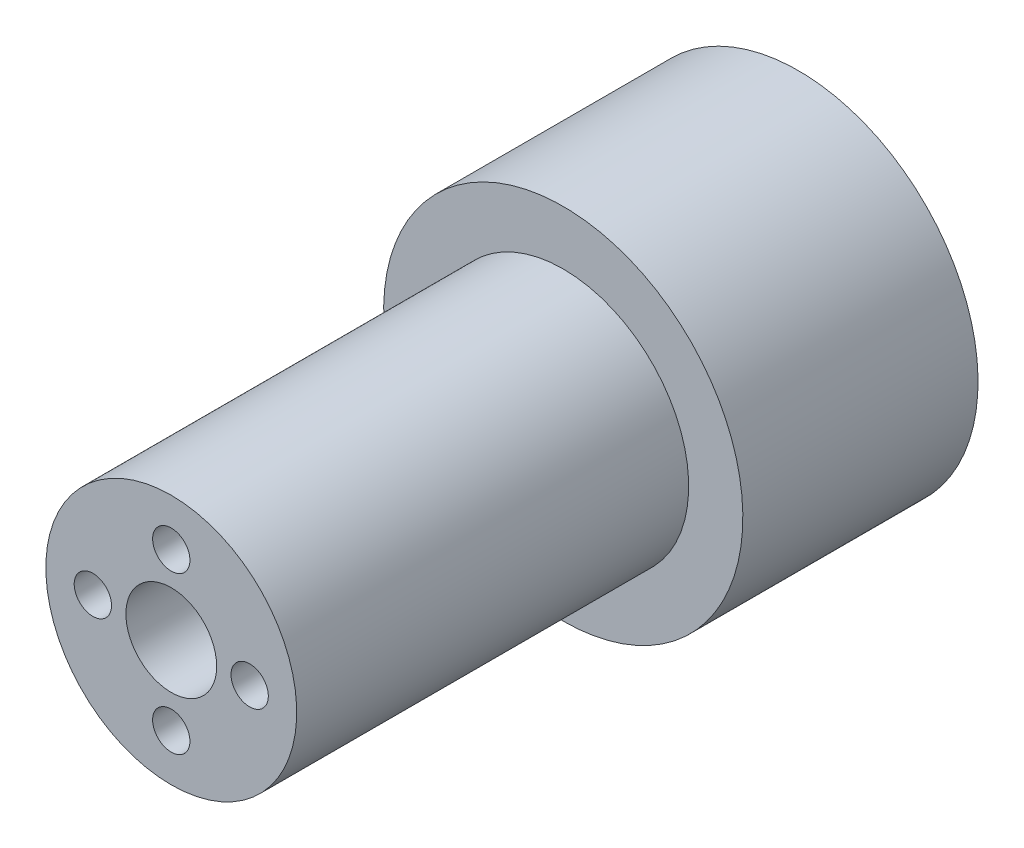
ISO-10303-21;
HEADER;
FILE_DESCRIPTION(('STEP AP214'),'2;1');
FILE_NAME('part.step','',(''),(''),'','','');
FILE_SCHEMA(('AUTOMOTIVE_DESIGN { 1 0 10303 214 1 1 1 1 }'));
ENDSEC;
DATA;
#1=APPLICATION_CONTEXT('core data for automotive mechanical design processes');
#2=APPLICATION_PROTOCOL_DEFINITION('international standard','automotive_design',2000,#1);
#3=PRODUCT_CONTEXT('',#1,'mechanical');
#4=PRODUCT('Part','Part','',(#3));
#5=PRODUCT_RELATED_PRODUCT_CATEGORY('part','',(#4));
#6=PRODUCT_DEFINITION_FORMATION('','',#4);
#7=PRODUCT_DEFINITION_CONTEXT('part definition',#1,'design');
#8=PRODUCT_DEFINITION('design','',#6,#7);
#9=PRODUCT_DEFINITION_SHAPE('','',#8);
#10=(LENGTH_UNIT() NAMED_UNIT(*) SI_UNIT(.MILLI.,.METRE.));
#11=(NAMED_UNIT(*) PLANE_ANGLE_UNIT() SI_UNIT($,.RADIAN.));
#12=(NAMED_UNIT(*) SI_UNIT($,.STERADIAN.) SOLID_ANGLE_UNIT());
#13=UNCERTAINTY_MEASURE_WITH_UNIT(LENGTH_MEASURE(1.E-05),#10,'distance_accuracy_value','');
#14=(GEOMETRIC_REPRESENTATION_CONTEXT(3) GLOBAL_UNCERTAINTY_ASSIGNED_CONTEXT((#13)) GLOBAL_UNIT_ASSIGNED_CONTEXT((#10,
#11,#12)) REPRESENTATION_CONTEXT('',''));
#15=CARTESIAN_POINT('',(0.,0.,0.));
#16=DIRECTION('',(0.,0.,1.));
#17=DIRECTION('',(1.,0.,0.));
#18=AXIS2_PLACEMENT_3D('',#15,#16,#17);
#19=CARTESIAN_POINT('',(0.,8.,0.));
#20=DIRECTION('',(0.,0.,-1.));
#21=DIRECTION('',(0.,1.,0.));
#22=AXIS2_PLACEMENT_3D('',#19,#20,#21);
#23=PLANE('',#22);
#24=CARTESIAN_POINT('',(0.,0.,0.));
#25=DIRECTION('',(0.,0.,1.));
#26=DIRECTION('',(1.,0.,0.));
#27=AXIS2_PLACEMENT_3D('',#24,#25,#26);
#28=CIRCLE('',#27,2.8956);
#29=CARTESIAN_POINT('',(2.8956,0.,0.));
#30=VERTEX_POINT('',#29);
#31=EDGE_CURVE('E82',#30,#30,#28,.T.);
#32=ORIENTED_EDGE('',*,*,#31,.F.);
#33=EDGE_LOOP('',(#32));
#34=FACE_BOUND('',#33,.T.);
#35=CARTESIAN_POINT('',(-5.,0.,0.));
#36=DIRECTION('',(0.,0.,1.));
#37=DIRECTION('',(1.,0.,0.));
#38=AXIS2_PLACEMENT_3D('',#35,#36,#37);
#39=CIRCLE('',#38,1.190625);
#40=CARTESIAN_POINT('',(-3.809375,0.,0.));
#41=VERTEX_POINT('',#40);
#42=EDGE_CURVE('E77',#41,#41,#39,.T.);
#43=ORIENTED_EDGE('',*,*,#42,.F.);
#44=EDGE_LOOP('',(#43));
#45=FACE_BOUND('',#44,.T.);
#46=CARTESIAN_POINT('',(0.,-5.,0.));
#47=DIRECTION('',(0.,0.,1.));
#48=DIRECTION('',(1.,0.,0.));
#49=AXIS2_PLACEMENT_3D('',#46,#47,#48);
#50=CIRCLE('',#49,1.190625);
#51=CARTESIAN_POINT('',(1.190625,-5.,0.));
#52=VERTEX_POINT('',#51);
#53=EDGE_CURVE('E68',#52,#52,#50,.T.);
#54=ORIENTED_EDGE('',*,*,#53,.F.);
#55=EDGE_LOOP('',(#54));
#56=FACE_BOUND('',#55,.T.);
#57=CARTESIAN_POINT('',(0.,5.,0.));
#58=DIRECTION('',(0.,0.,1.));
#59=DIRECTION('',(1.,0.,0.));
#60=AXIS2_PLACEMENT_3D('',#57,#58,#59);
#61=CIRCLE('',#60,1.190625);
#62=CARTESIAN_POINT('',(1.190625,5.,0.));
#63=VERTEX_POINT('',#62);
#64=EDGE_CURVE('E61',#63,#63,#61,.T.);
#65=ORIENTED_EDGE('',*,*,#64,.F.);
#66=EDGE_LOOP('',(#65));
#67=FACE_BOUND('',#66,.T.);
#68=CARTESIAN_POINT('',(5.,0.,0.));
#69=DIRECTION('',(0.,0.,1.));
#70=DIRECTION('',(1.,0.,0.));
#71=AXIS2_PLACEMENT_3D('',#68,#69,#70);
#72=CIRCLE('',#71,1.190625);
#73=CARTESIAN_POINT('',(6.190625,0.,0.));
#74=VERTEX_POINT('',#73);
#75=EDGE_CURVE('E60',#74,#74,#72,.T.);
#76=ORIENTED_EDGE('',*,*,#75,.F.);
#77=EDGE_LOOP('',(#76));
#78=FACE_BOUND('',#77,.T.);
#79=CARTESIAN_POINT('',(0.,0.,0.));
#80=DIRECTION('',(0.,0.,1.));
#81=DIRECTION('',(0.,-1.,0.));
#82=AXIS2_PLACEMENT_3D('',#79,#80,#81);
#83=CIRCLE('',#82,8.);
#84=CARTESIAN_POINT('',(0.,-8.,0.));
#85=VERTEX_POINT('',#84);
#86=EDGE_CURVE('E51',#85,#85,#83,.T.);
#87=ORIENTED_EDGE('',*,*,#86,.T.);
#88=EDGE_LOOP('',(#87));
#89=FACE_BOUND('',#88,.T.);
#90=ADVANCED_FACE('F40',(#34,#45,#56,#67,#78,#89),#23,.F.);
#91=CARTESIAN_POINT('',(0.,0.,-40.));
#92=DIRECTION('',(0.,0.,1.));
#93=DIRECTION('',(0.,-1.,0.));
#94=AXIS2_PLACEMENT_3D('',#91,#92,#93);
#95=PLANE('',#94);
#96=CARTESIAN_POINT('',(0.,0.,-40.));
#97=DIRECTION('',(0.,0.,1.));
#98=DIRECTION('',(0.,-1.,0.));
#99=AXIS2_PLACEMENT_3D('',#96,#97,#98);
#100=CIRCLE('',#99,11.455);
#101=CARTESIAN_POINT('',(0.,-11.455,-40.));
#102=VERTEX_POINT('',#101);
#103=EDGE_CURVE('E10',#102,#102,#100,.T.);
#104=ORIENTED_EDGE('',*,*,#103,.F.);
#105=EDGE_LOOP('',(#104));
#106=FACE_BOUND('',#105,.T.);
#107=ADVANCED_FACE('F96',(#106),#95,.F.);
#108=CARTESIAN_POINT('',(0.,0.,0.));
#109=DIRECTION('',(0.,0.,1.));
#110=DIRECTION('',(0.,-1.,0.));
#111=AXIS2_PLACEMENT_3D('',#108,#109,#110);
#112=CYLINDRICAL_SURFACE('',#111,11.455);
#113=CARTESIAN_POINT('',(0.,0.,-25.));
#114=DIRECTION('',(0.,0.,1.));
#115=DIRECTION('',(0.,-1.,0.));
#116=AXIS2_PLACEMENT_3D('',#113,#114,#115);
#117=CIRCLE('',#116,11.455);
#118=CARTESIAN_POINT('',(0.,-11.455,-25.));
#119=VERTEX_POINT('',#118);
#120=EDGE_CURVE('E43',#119,#119,#117,.T.);
#121=ORIENTED_EDGE('',*,*,#120,.F.);
#122=EDGE_LOOP('',(#121));
#123=FACE_BOUND('',#122,.T.);
#124=ORIENTED_EDGE('',*,*,#103,.T.);
#125=EDGE_LOOP('',(#124));
#126=FACE_BOUND('',#125,.T.);
#127=ADVANCED_FACE('F117',(#123,#126),#112,.T.);
#128=CARTESIAN_POINT('',(0.,11.455,-25.));
#129=DIRECTION('',(0.,0.,-1.));
#130=DIRECTION('',(0.,1.,0.));
#131=AXIS2_PLACEMENT_3D('',#128,#129,#130);
#132=PLANE('',#131);
#133=CARTESIAN_POINT('',(0.,0.,-25.));
#134=DIRECTION('',(0.,0.,1.));
#135=DIRECTION('',(0.,-1.,0.));
#136=AXIS2_PLACEMENT_3D('',#133,#134,#135);
#137=CIRCLE('',#136,8.);
#138=CARTESIAN_POINT('',(0.,-8.,-25.));
#139=VERTEX_POINT('',#138);
#140=EDGE_CURVE('E50',#139,#139,#137,.T.);
#141=ORIENTED_EDGE('',*,*,#140,.F.);
#142=EDGE_LOOP('',(#141));
#143=FACE_BOUND('',#142,.T.);
#144=ORIENTED_EDGE('',*,*,#120,.T.);
#145=EDGE_LOOP('',(#144));
#146=FACE_BOUND('',#145,.T.);
#147=ADVANCED_FACE('F113',(#143,#146),#132,.F.);
#148=CARTESIAN_POINT('',(0.,0.,0.));
#149=DIRECTION('',(0.,0.,1.));
#150=DIRECTION('',(0.,-1.,0.));
#151=AXIS2_PLACEMENT_3D('',#148,#149,#150);
#152=CYLINDRICAL_SURFACE('',#151,8.);
#153=ORIENTED_EDGE('',*,*,#86,.F.);
#154=EDGE_LOOP('',(#153));
#155=FACE_BOUND('',#154,.T.);
#156=ORIENTED_EDGE('',*,*,#140,.T.);
#157=EDGE_LOOP('',(#156));
#158=FACE_BOUND('',#157,.T.);
#159=ADVANCED_FACE('F107',(#155,#158),#152,.T.);
#160=CARTESIAN_POINT('',(5.,0.,-8.));
#161=DIRECTION('',(0.,0.,1.));
#162=DIRECTION('',(1.,0.,0.));
#163=AXIS2_PLACEMENT_3D('',#160,#161,#162);
#164=CYLINDRICAL_SURFACE('',#163,1.190625);
#165=CARTESIAN_POINT('',(5.,0.,-8.));
#166=DIRECTION('',(0.,0.,1.));
#167=DIRECTION('',(1.,0.,0.));
#168=AXIS2_PLACEMENT_3D('',#165,#166,#167);
#169=CIRCLE('',#168,1.190625);
#170=CARTESIAN_POINT('',(6.190625,0.,-8.));
#171=VERTEX_POINT('',#170);
#172=EDGE_CURVE('E58',#171,#171,#169,.T.);
#173=ORIENTED_EDGE('',*,*,#172,.F.);
#174=EDGE_LOOP('',(#173));
#175=FACE_BOUND('',#174,.T.);
#176=ORIENTED_EDGE('',*,*,#75,.T.);
#177=EDGE_LOOP('',(#176));
#178=FACE_BOUND('',#177,.T.);
#179=ADVANCED_FACE('F115',(#175,#178),#164,.F.);
#180=CARTESIAN_POINT('',(0.,0.,-8.));
#181=DIRECTION('',(0.,0.,1.));
#182=DIRECTION('',(1.,0.,0.));
#183=AXIS2_PLACEMENT_3D('',#180,#181,#182);
#184=PLANE('',#183);
#185=ORIENTED_EDGE('',*,*,#172,.T.);
#186=EDGE_LOOP('',(#185));
#187=FACE_BOUND('',#186,.T.);
#188=ADVANCED_FACE('F157',(#187),#184,.T.);
#189=CARTESIAN_POINT('',(0.,5.,-8.));
#190=DIRECTION('',(0.,0.,1.));
#191=DIRECTION('',(1.,0.,0.));
#192=AXIS2_PLACEMENT_3D('',#189,#190,#191);
#193=CYLINDRICAL_SURFACE('',#192,1.190625);
#194=CARTESIAN_POINT('',(0.,5.,-8.));
#195=DIRECTION('',(0.,0.,1.));
#196=DIRECTION('',(1.,0.,0.));
#197=AXIS2_PLACEMENT_3D('',#194,#195,#196);
#198=CIRCLE('',#197,1.190625);
#199=CARTESIAN_POINT('',(1.190625,5.,-8.));
#200=VERTEX_POINT('',#199);
#201=EDGE_CURVE('E70',#200,#200,#198,.T.);
#202=ORIENTED_EDGE('',*,*,#201,.F.);
#203=EDGE_LOOP('',(#202));
#204=FACE_BOUND('',#203,.T.);
#205=ORIENTED_EDGE('',*,*,#64,.T.);
#206=EDGE_LOOP('',(#205));
#207=FACE_BOUND('',#206,.T.);
#208=ADVANCED_FACE('F164',(#204,#207),#193,.F.);
#209=CARTESIAN_POINT('',(0.,0.,-8.));
#210=DIRECTION('',(0.,0.,1.));
#211=DIRECTION('',(1.,0.,0.));
#212=AXIS2_PLACEMENT_3D('',#209,#210,#211);
#213=PLANE('',#212);
#214=ORIENTED_EDGE('',*,*,#201,.T.);
#215=EDGE_LOOP('',(#214));
#216=FACE_BOUND('',#215,.T.);
#217=ADVANCED_FACE('F174',(#216),#213,.T.);
#218=CARTESIAN_POINT('',(0.,-5.,-8.));
#219=DIRECTION('',(0.,0.,1.));
#220=DIRECTION('',(1.,0.,0.));
#221=AXIS2_PLACEMENT_3D('',#218,#219,#220);
#222=CYLINDRICAL_SURFACE('',#221,1.190625);
#223=CARTESIAN_POINT('',(0.,-5.,-8.));
#224=DIRECTION('',(0.,0.,1.));
#225=DIRECTION('',(1.,0.,0.));
#226=AXIS2_PLACEMENT_3D('',#223,#224,#225);
#227=CIRCLE('',#226,1.190625);
#228=CARTESIAN_POINT('',(1.190625,-5.,-8.));
#229=VERTEX_POINT('',#228);
#230=EDGE_CURVE('E74',#229,#229,#227,.T.);
#231=ORIENTED_EDGE('',*,*,#230,.F.);
#232=EDGE_LOOP('',(#231));
#233=FACE_BOUND('',#232,.T.);
#234=ORIENTED_EDGE('',*,*,#53,.T.);
#235=EDGE_LOOP('',(#234));
#236=FACE_BOUND('',#235,.T.);
#237=ADVANCED_FACE('F184',(#233,#236),#222,.F.);
#238=CARTESIAN_POINT('',(0.,0.,-8.));
#239=DIRECTION('',(0.,0.,1.));
#240=DIRECTION('',(1.,0.,0.));
#241=AXIS2_PLACEMENT_3D('',#238,#239,#240);
#242=PLANE('',#241);
#243=ORIENTED_EDGE('',*,*,#230,.T.);
#244=EDGE_LOOP('',(#243));
#245=FACE_BOUND('',#244,.T.);
#246=ADVANCED_FACE('F193',(#245),#242,.T.);
#247=CARTESIAN_POINT('',(-5.,0.,-8.));
#248=DIRECTION('',(0.,0.,1.));
#249=DIRECTION('',(1.,0.,0.));
#250=AXIS2_PLACEMENT_3D('',#247,#248,#249);
#251=CYLINDRICAL_SURFACE('',#250,1.190625);
#252=CARTESIAN_POINT('',(-5.,0.,-8.));
#253=DIRECTION('',(0.,0.,1.));
#254=DIRECTION('',(1.,0.,0.));
#255=AXIS2_PLACEMENT_3D('',#252,#253,#254);
#256=CIRCLE('',#255,1.190625);
#257=CARTESIAN_POINT('',(-3.809375,0.,-8.));
#258=VERTEX_POINT('',#257);
#259=EDGE_CURVE('E57',#258,#258,#256,.T.);
#260=ORIENTED_EDGE('',*,*,#259,.F.);
#261=EDGE_LOOP('',(#260));
#262=FACE_BOUND('',#261,.T.);
#263=ORIENTED_EDGE('',*,*,#42,.T.);
#264=EDGE_LOOP('',(#263));
#265=FACE_BOUND('',#264,.T.);
#266=ADVANCED_FACE('F203',(#262,#265),#251,.F.);
#267=CARTESIAN_POINT('',(0.,0.,-8.));
#268=DIRECTION('',(0.,0.,1.));
#269=DIRECTION('',(1.,0.,0.));
#270=AXIS2_PLACEMENT_3D('',#267,#268,#269);
#271=PLANE('',#270);
#272=ORIENTED_EDGE('',*,*,#259,.T.);
#273=EDGE_LOOP('',(#272));
#274=FACE_BOUND('',#273,.T.);
#275=ADVANCED_FACE('F95',(#274),#271,.T.);
#276=CARTESIAN_POINT('',(0.,0.,-16.));
#277=DIRECTION('',(0.,0.,1.));
#278=DIRECTION('',(1.,0.,0.));
#279=AXIS2_PLACEMENT_3D('',#276,#277,#278);
#280=CYLINDRICAL_SURFACE('',#279,2.8956);
#281=CARTESIAN_POINT('',(0.,0.,-16.));
#282=DIRECTION('',(0.,0.,1.));
#283=DIRECTION('',(1.,0.,0.));
#284=AXIS2_PLACEMENT_3D('',#281,#282,#283);
#285=CIRCLE('',#284,2.8956);
#286=CARTESIAN_POINT('',(2.8956,0.,-16.));
#287=VERTEX_POINT('',#286);
#288=EDGE_CURVE('E62',#287,#287,#285,.T.);
#289=ORIENTED_EDGE('',*,*,#288,.F.);
#290=EDGE_LOOP('',(#289));
#291=FACE_BOUND('',#290,.T.);
#292=ORIENTED_EDGE('',*,*,#31,.T.);
#293=EDGE_LOOP('',(#292));
#294=FACE_BOUND('',#293,.T.);
#295=ADVANCED_FACE('F86',(#291,#294),#280,.F.);
#296=CARTESIAN_POINT('',(0.,0.,-16.));
#297=DIRECTION('',(0.,0.,1.));
#298=DIRECTION('',(1.,0.,0.));
#299=AXIS2_PLACEMENT_3D('',#296,#297,#298);
#300=PLANE('',#299);
#301=ORIENTED_EDGE('',*,*,#288,.T.);
#302=EDGE_LOOP('',(#301));
#303=FACE_BOUND('',#302,.T.);
#304=ADVANCED_FACE('F90',(#303),#300,.T.);
#305=CLOSED_SHELL('',(#90,#107,#127,#147,#159,#179,#188,#208,#217,#237,#246,#266,#275,#295,#304));
#306=MANIFOLD_SOLID_BREP('B2',#305);
#307=ADVANCED_BREP_SHAPE_REPRESENTATION('',(#18,#306),#14);
#308=SHAPE_DEFINITION_REPRESENTATION(#9,#307);
ENDSEC;
END-ISO-10303-21;
